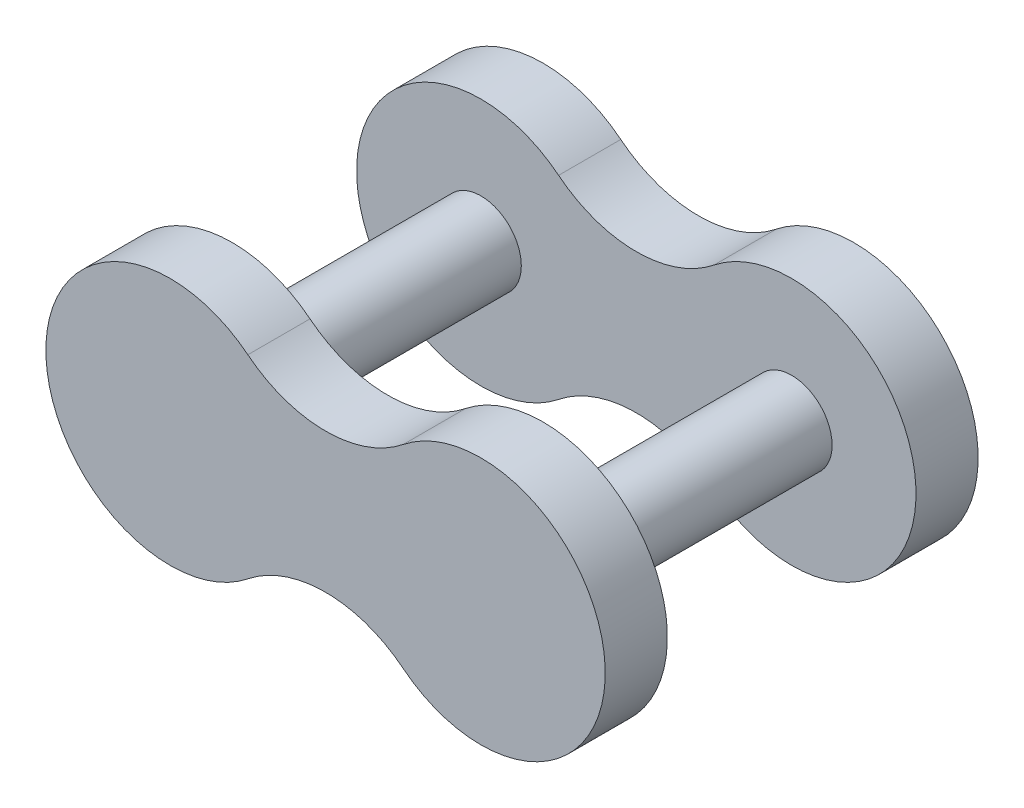
ISO-10303-21;
HEADER;
FILE_DESCRIPTION(('STEP AP214'),'2;1');
FILE_NAME('part.step','',(''),(''),'','','');
FILE_SCHEMA(('AUTOMOTIVE_DESIGN { 1 0 10303 214 1 1 1 1 }'));
ENDSEC;
DATA;
#1=APPLICATION_CONTEXT('core data for automotive mechanical design processes');
#2=APPLICATION_PROTOCOL_DEFINITION('international standard','automotive_design',2000,#1);
#3=PRODUCT_CONTEXT('',#1,'mechanical');
#4=PRODUCT('Part','Part','',(#3));
#5=PRODUCT_RELATED_PRODUCT_CATEGORY('part','',(#4));
#6=PRODUCT_DEFINITION_FORMATION('','',#4);
#7=PRODUCT_DEFINITION_CONTEXT('part definition',#1,'design');
#8=PRODUCT_DEFINITION('design','',#6,#7);
#9=PRODUCT_DEFINITION_SHAPE('','',#8);
#10=(LENGTH_UNIT() NAMED_UNIT(*) SI_UNIT(.MILLI.,.METRE.));
#11=(NAMED_UNIT(*) PLANE_ANGLE_UNIT() SI_UNIT($,.RADIAN.));
#12=(NAMED_UNIT(*) SI_UNIT($,.STERADIAN.) SOLID_ANGLE_UNIT());
#13=UNCERTAINTY_MEASURE_WITH_UNIT(LENGTH_MEASURE(1.E-05),#10,'distance_accuracy_value','');
#14=(GEOMETRIC_REPRESENTATION_CONTEXT(3) GLOBAL_UNCERTAINTY_ASSIGNED_CONTEXT((#13)) GLOBAL_UNIT_ASSIGNED_CONTEXT((#10,
#11,#12)) REPRESENTATION_CONTEXT('',''));
#15=CARTESIAN_POINT('',(0.,0.,0.));
#16=DIRECTION('',(0.,0.,1.));
#17=DIRECTION('',(1.,0.,0.));
#18=AXIS2_PLACEMENT_3D('',#15,#16,#17);
#19=CARTESIAN_POINT('',(3.175,0.,2.54));
#20=DIRECTION('',(0.,0.,-1.));
#21=DIRECTION('',(-1.,0.,0.));
#22=AXIS2_PLACEMENT_3D('',#19,#20,#21);
#23=CYLINDRICAL_SURFACE('',#22,0.8255);
#24=CARTESIAN_POINT('',(3.175,0.,2.54));
#25=DIRECTION('',(0.,0.,1.));
#26=DIRECTION('',(1.,0.,0.));
#27=AXIS2_PLACEMENT_3D('',#24,#25,#26);
#28=CIRCLE('',#27,0.8255);
#29=CARTESIAN_POINT('',(4.0005,0.,2.54));
#30=VERTEX_POINT('',#29);
#31=EDGE_CURVE('E48',#30,#30,#28,.T.);
#32=ORIENTED_EDGE('',*,*,#31,.F.);
#33=EDGE_LOOP('',(#32));
#34=FACE_BOUND('',#33,.T.);
#35=CARTESIAN_POINT('',(3.175,0.,-2.54));
#36=DIRECTION('',(0.,0.,1.));
#37=DIRECTION('',(1.,0.,0.));
#38=AXIS2_PLACEMENT_3D('',#35,#36,#37);
#39=CIRCLE('',#38,0.8255);
#40=CARTESIAN_POINT('',(4.0005,0.,-2.54));
#41=VERTEX_POINT('',#40);
#42=EDGE_CURVE('E173',#41,#41,#39,.T.);
#43=ORIENTED_EDGE('',*,*,#42,.T.);
#44=EDGE_LOOP('',(#43));
#45=FACE_BOUND('',#44,.T.);
#46=ADVANCED_FACE('F39',(#34,#45),#23,.T.);
#47=CARTESIAN_POINT('',(0.,3.96557372898298,3.81));
#48=DIRECTION('',(0.,0.,-1.));
#49=DIRECTION('',(-1.,0.,0.));
#50=AXIS2_PLACEMENT_3D('',#47,#48,#49);
#51=CYLINDRICAL_SURFACE('',#50,2.54);
#52=CARTESIAN_POINT('',(0.,3.96557372898298,2.54));
#53=DIRECTION('',(0.,0.,-1.));
#54=DIRECTION('',(1.,0.,0.));
#55=AXIS2_PLACEMENT_3D('',#52,#53,#54);
#56=CIRCLE('',#55,2.54);
#57=CARTESIAN_POINT('',(1.5875,1.98278686449149,2.54));
#58=VERTEX_POINT('',#57);
#59=CARTESIAN_POINT('',(-1.5875,1.98278686449149,2.54));
#60=VERTEX_POINT('',#59);
#61=EDGE_CURVE('E185',#58,#60,#56,.T.);
#62=ORIENTED_EDGE('',*,*,#61,.T.);
#63=DIRECTION('',(0.,0.,-1.));
#64=VECTOR('',#63,1.);
#65=CARTESIAN_POINT('',(-1.5875,1.98278686449149,3.81));
#66=LINE('',#65,#64);
#67=CARTESIAN_POINT('',(-1.5875,1.98278686449149,3.81));
#68=VERTEX_POINT('',#67);
#69=EDGE_CURVE('E204',#68,#60,#66,.T.);
#70=ORIENTED_EDGE('',*,*,#69,.F.);
#71=CARTESIAN_POINT('',(0.,3.96557372898298,3.81));
#72=DIRECTION('',(0.,0.,-1.));
#73=DIRECTION('',(1.,0.,0.));
#74=AXIS2_PLACEMENT_3D('',#71,#72,#73);
#75=CIRCLE('',#74,2.54);
#76=CARTESIAN_POINT('',(1.5875,1.98278686449149,3.81));
#77=VERTEX_POINT('',#76);
#78=EDGE_CURVE('E174',#77,#68,#75,.T.);
#79=ORIENTED_EDGE('',*,*,#78,.F.);
#80=DIRECTION('',(0.,0.,-1.));
#81=VECTOR('',#80,1.);
#82=CARTESIAN_POINT('',(1.5875,1.98278686449149,3.81));
#83=LINE('',#82,#81);
#84=EDGE_CURVE('E184',#77,#58,#83,.T.);
#85=ORIENTED_EDGE('',*,*,#84,.T.);
#86=EDGE_LOOP('',(#62,#70,#79,#85));
#87=FACE_BOUND('',#86,.T.);
#88=ADVANCED_FACE('F235',(#87),#51,.F.);
#89=CARTESIAN_POINT('',(-3.175,0.,3.81));
#90=DIRECTION('',(0.,0.,-1.));
#91=DIRECTION('',(-1.,0.,0.));
#92=AXIS2_PLACEMENT_3D('',#89,#90,#91);
#93=CYLINDRICAL_SURFACE('',#92,2.54);
#94=CARTESIAN_POINT('',(-3.175,0.,2.54));
#95=DIRECTION('',(0.,0.,1.));
#96=DIRECTION('',(1.,0.,0.));
#97=AXIS2_PLACEMENT_3D('',#94,#95,#96);
#98=CIRCLE('',#97,2.54);
#99=CARTESIAN_POINT('',(-1.5875,-1.98278686449149,2.54));
#100=VERTEX_POINT('',#99);
#101=EDGE_CURVE('E189',#60,#100,#98,.T.);
#102=ORIENTED_EDGE('',*,*,#101,.T.);
#103=DIRECTION('',(0.,0.,-1.));
#104=VECTOR('',#103,1.);
#105=CARTESIAN_POINT('',(-1.5875,-1.98278686449149,3.81));
#106=LINE('',#105,#104);
#107=CARTESIAN_POINT('',(-1.5875,-1.98278686449149,3.81));
#108=VERTEX_POINT('',#107);
#109=EDGE_CURVE('E201',#108,#100,#106,.T.);
#110=ORIENTED_EDGE('',*,*,#109,.F.);
#111=CARTESIAN_POINT('',(-3.175,0.,3.81));
#112=DIRECTION('',(0.,0.,1.));
#113=DIRECTION('',(1.,0.,0.));
#114=AXIS2_PLACEMENT_3D('',#111,#112,#113);
#115=CIRCLE('',#114,2.54);
#116=EDGE_CURVE('E88',#68,#108,#115,.T.);
#117=ORIENTED_EDGE('',*,*,#116,.F.);
#118=ORIENTED_EDGE('',*,*,#69,.T.);
#119=EDGE_LOOP('',(#102,#110,#117,#118));
#120=FACE_BOUND('',#119,.T.);
#121=ADVANCED_FACE('F240',(#120),#93,.T.);
#122=CARTESIAN_POINT('',(0.,-3.96557372898298,3.81));
#123=DIRECTION('',(0.,0.,-1.));
#124=DIRECTION('',(-1.,0.,0.));
#125=AXIS2_PLACEMENT_3D('',#122,#123,#124);
#126=CYLINDRICAL_SURFACE('',#125,2.54);
#127=CARTESIAN_POINT('',(0.,-3.96557372898298,2.54));
#128=DIRECTION('',(0.,0.,-1.));
#129=DIRECTION('',(1.,0.,0.));
#130=AXIS2_PLACEMENT_3D('',#127,#128,#129);
#131=CIRCLE('',#130,2.54);
#132=CARTESIAN_POINT('',(1.5875,-1.98278686449149,2.54));
#133=VERTEX_POINT('',#132);
#134=EDGE_CURVE('E74',#100,#133,#131,.T.);
#135=ORIENTED_EDGE('',*,*,#134,.T.);
#136=DIRECTION('',(0.,0.,-1.));
#137=VECTOR('',#136,1.);
#138=CARTESIAN_POINT('',(1.5875,-1.98278686449149,3.81));
#139=LINE('',#138,#137);
#140=CARTESIAN_POINT('',(1.5875,-1.98278686449149,3.81));
#141=VERTEX_POINT('',#140);
#142=EDGE_CURVE('E198',#141,#133,#139,.T.);
#143=ORIENTED_EDGE('',*,*,#142,.F.);
#144=CARTESIAN_POINT('',(0.,-3.96557372898298,3.81));
#145=DIRECTION('',(0.,0.,-1.));
#146=DIRECTION('',(1.,0.,0.));
#147=AXIS2_PLACEMENT_3D('',#144,#145,#146);
#148=CIRCLE('',#147,2.54);
#149=EDGE_CURVE('E179',#108,#141,#148,.T.);
#150=ORIENTED_EDGE('',*,*,#149,.F.);
#151=ORIENTED_EDGE('',*,*,#109,.T.);
#152=EDGE_LOOP('',(#135,#143,#150,#151));
#153=FACE_BOUND('',#152,.T.);
#154=ADVANCED_FACE('F256',(#153),#126,.F.);
#155=CARTESIAN_POINT('',(3.175,0.,3.81));
#156=DIRECTION('',(0.,0.,-1.));
#157=DIRECTION('',(-1.,0.,0.));
#158=AXIS2_PLACEMENT_3D('',#155,#156,#157);
#159=CYLINDRICAL_SURFACE('',#158,2.54);
#160=CARTESIAN_POINT('',(3.175,0.,2.54));
#161=DIRECTION('',(0.,0.,1.));
#162=DIRECTION('',(1.,0.,0.));
#163=AXIS2_PLACEMENT_3D('',#160,#161,#162);
#164=CIRCLE('',#163,2.54);
#165=EDGE_CURVE('E80',#133,#58,#164,.T.);
#166=ORIENTED_EDGE('',*,*,#165,.T.);
#167=ORIENTED_EDGE('',*,*,#84,.F.);
#168=CARTESIAN_POINT('',(3.175,0.,3.81));
#169=DIRECTION('',(0.,0.,1.));
#170=DIRECTION('',(1.,0.,0.));
#171=AXIS2_PLACEMENT_3D('',#168,#169,#170);
#172=CIRCLE('',#171,2.54);
#173=EDGE_CURVE('E56',#141,#77,#172,.T.);
#174=ORIENTED_EDGE('',*,*,#173,.F.);
#175=ORIENTED_EDGE('',*,*,#142,.T.);
#176=EDGE_LOOP('',(#166,#167,#174,#175));
#177=FACE_BOUND('',#176,.T.);
#178=ADVANCED_FACE('F254',(#177),#159,.T.);
#179=CARTESIAN_POINT('',(1.5875,1.98278686449149,3.81));
#180=DIRECTION('',(0.,0.,1.));
#181=DIRECTION('',(1.,0.,0.));
#182=AXIS2_PLACEMENT_3D('',#179,#180,#181);
#183=PLANE('',#182);
#184=ORIENTED_EDGE('',*,*,#78,.T.);
#185=ORIENTED_EDGE('',*,*,#116,.T.);
#186=ORIENTED_EDGE('',*,*,#149,.T.);
#187=ORIENTED_EDGE('',*,*,#173,.T.);
#188=EDGE_LOOP('',(#184,#185,#186,#187));
#189=FACE_BOUND('',#188,.T.);
#190=ADVANCED_FACE('F248',(#189),#183,.T.);
#191=CARTESIAN_POINT('',(1.5875,1.98278686449149,2.54));
#192=DIRECTION('',(0.,0.,1.));
#193=DIRECTION('',(1.,0.,0.));
#194=AXIS2_PLACEMENT_3D('',#191,#192,#193);
#195=PLANE('',#194);
#196=CARTESIAN_POINT('',(-3.175,0.,2.54));
#197=DIRECTION('',(0.,0.,1.));
#198=DIRECTION('',(1.,0.,0.));
#199=AXIS2_PLACEMENT_3D('',#196,#197,#198);
#200=CIRCLE('',#199,0.8255);
#201=CARTESIAN_POINT('',(-2.3495,0.,2.54));
#202=VERTEX_POINT('',#201);
#203=EDGE_CURVE('E11',#202,#202,#200,.F.);
#204=ORIENTED_EDGE('',*,*,#203,.F.);
#205=EDGE_LOOP('',(#204));
#206=FACE_BOUND('',#205,.T.);
#207=ORIENTED_EDGE('',*,*,#31,.T.);
#208=EDGE_LOOP('',(#207));
#209=FACE_BOUND('',#208,.T.);
#210=ORIENTED_EDGE('',*,*,#61,.F.);
#211=ORIENTED_EDGE('',*,*,#165,.F.);
#212=ORIENTED_EDGE('',*,*,#134,.F.);
#213=ORIENTED_EDGE('',*,*,#101,.F.);
#214=EDGE_LOOP('',(#210,#211,#212,#213));
#215=FACE_BOUND('',#214,.T.);
#216=ADVANCED_FACE('F244',(#206,#209,#215),#195,.F.);
#217=CARTESIAN_POINT('',(-3.175,0.,2.54));
#218=DIRECTION('',(0.,0.,-1.));
#219=DIRECTION('',(-1.,0.,0.));
#220=AXIS2_PLACEMENT_3D('',#217,#218,#219);
#221=CYLINDRICAL_SURFACE('',#220,0.8255);
#222=ORIENTED_EDGE('',*,*,#203,.T.);
#223=EDGE_LOOP('',(#222));
#224=FACE_BOUND('',#223,.T.);
#225=CARTESIAN_POINT('',(-3.175,0.,-2.54));
#226=DIRECTION('',(0.,0.,1.));
#227=DIRECTION('',(1.,0.,0.));
#228=AXIS2_PLACEMENT_3D('',#225,#226,#227);
#229=CIRCLE('',#228,0.8255);
#230=CARTESIAN_POINT('',(-2.3495,0.,-2.54));
#231=VERTEX_POINT('',#230);
#232=EDGE_CURVE('E127',#231,#231,#229,.T.);
#233=ORIENTED_EDGE('',*,*,#232,.T.);
#234=EDGE_LOOP('',(#233));
#235=FACE_BOUND('',#234,.T.);
#236=ADVANCED_FACE('F247',(#224,#235),#221,.T.);
#237=CARTESIAN_POINT('',(0.,3.96557372898298,-3.81));
#238=DIRECTION('',(0.,0.,1.));
#239=DIRECTION('',(1.,0.,0.));
#240=AXIS2_PLACEMENT_3D('',#237,#238,#239);
#241=CYLINDRICAL_SURFACE('',#240,2.54);
#242=CARTESIAN_POINT('',(0.,3.96557372898298,-2.54));
#243=DIRECTION('',(0.,0.,-1.));
#244=DIRECTION('',(1.,0.,0.));
#245=AXIS2_PLACEMENT_3D('',#242,#243,#244);
#246=CIRCLE('',#245,2.54);
#247=CARTESIAN_POINT('',(1.5875,1.98278686449149,-2.54));
#248=VERTEX_POINT('',#247);
#249=CARTESIAN_POINT('',(-1.5875,1.98278686449149,-2.54));
#250=VERTEX_POINT('',#249);
#251=EDGE_CURVE('E121',#248,#250,#246,.T.);
#252=ORIENTED_EDGE('',*,*,#251,.F.);
#253=DIRECTION('',(0.,0.,1.));
#254=VECTOR('',#253,1.);
#255=CARTESIAN_POINT('',(1.5875,1.98278686449149,-3.81));
#256=LINE('',#255,#254);
#257=CARTESIAN_POINT('',(1.5875,1.98278686449149,-3.81));
#258=VERTEX_POINT('',#257);
#259=EDGE_CURVE('E115',#258,#248,#256,.T.);
#260=ORIENTED_EDGE('',*,*,#259,.F.);
#261=CARTESIAN_POINT('',(0.,3.96557372898298,-3.81));
#262=DIRECTION('',(0.,0.,-1.));
#263=DIRECTION('',(1.,0.,0.));
#264=AXIS2_PLACEMENT_3D('',#261,#262,#263);
#265=CIRCLE('',#264,2.54);
#266=CARTESIAN_POINT('',(-1.5875,1.98278686449149,-3.81));
#267=VERTEX_POINT('',#266);
#268=EDGE_CURVE('E118',#258,#267,#265,.T.);
#269=ORIENTED_EDGE('',*,*,#268,.T.);
#270=DIRECTION('',(0.,0.,1.));
#271=VECTOR('',#270,1.);
#272=CARTESIAN_POINT('',(-1.5875,1.98278686449149,-3.81));
#273=LINE('',#272,#271);
#274=EDGE_CURVE('E150',#267,#250,#273,.T.);
#275=ORIENTED_EDGE('',*,*,#274,.T.);
#276=EDGE_LOOP('',(#252,#260,#269,#275));
#277=FACE_BOUND('',#276,.T.);
#278=ADVANCED_FACE('F117',(#277),#241,.F.);
#279=CARTESIAN_POINT('',(3.175,0.,-3.81));
#280=DIRECTION('',(0.,0.,1.));
#281=DIRECTION('',(1.,0.,0.));
#282=AXIS2_PLACEMENT_3D('',#279,#280,#281);
#283=CYLINDRICAL_SURFACE('',#282,2.54);
#284=CARTESIAN_POINT('',(3.175,0.,-2.54));
#285=DIRECTION('',(0.,0.,1.));
#286=DIRECTION('',(1.,0.,0.));
#287=AXIS2_PLACEMENT_3D('',#284,#285,#286);
#288=CIRCLE('',#287,2.54);
#289=CARTESIAN_POINT('',(1.5875,-1.98278686449149,-2.54));
#290=VERTEX_POINT('',#289);
#291=EDGE_CURVE('E153',#290,#248,#288,.T.);
#292=ORIENTED_EDGE('',*,*,#291,.F.);
#293=DIRECTION('',(0.,0.,1.));
#294=VECTOR('',#293,1.);
#295=CARTESIAN_POINT('',(1.5875,-1.98278686449149,-3.81));
#296=LINE('',#295,#294);
#297=CARTESIAN_POINT('',(1.5875,-1.98278686449149,-3.81));
#298=VERTEX_POINT('',#297);
#299=EDGE_CURVE('E128',#298,#290,#296,.T.);
#300=ORIENTED_EDGE('',*,*,#299,.F.);
#301=CARTESIAN_POINT('',(3.175,0.,-3.81));
#302=DIRECTION('',(0.,0.,1.));
#303=DIRECTION('',(1.,0.,0.));
#304=AXIS2_PLACEMENT_3D('',#301,#302,#303);
#305=CIRCLE('',#304,2.54);
#306=EDGE_CURVE('E134',#298,#258,#305,.T.);
#307=ORIENTED_EDGE('',*,*,#306,.T.);
#308=ORIENTED_EDGE('',*,*,#259,.T.);
#309=EDGE_LOOP('',(#292,#300,#307,#308));
#310=FACE_BOUND('',#309,.T.);
#311=ADVANCED_FACE('F141',(#310),#283,.T.);
#312=CARTESIAN_POINT('',(0.,-3.96557372898298,-3.81));
#313=DIRECTION('',(0.,0.,1.));
#314=DIRECTION('',(1.,0.,0.));
#315=AXIS2_PLACEMENT_3D('',#312,#313,#314);
#316=CYLINDRICAL_SURFACE('',#315,2.54);
#317=CARTESIAN_POINT('',(0.,-3.96557372898298,-2.54));
#318=DIRECTION('',(0.,0.,-1.));
#319=DIRECTION('',(1.,0.,0.));
#320=AXIS2_PLACEMENT_3D('',#317,#318,#319);
#321=CIRCLE('',#320,2.54);
#322=CARTESIAN_POINT('',(-1.5875,-1.98278686449149,-2.54));
#323=VERTEX_POINT('',#322);
#324=EDGE_CURVE('E156',#323,#290,#321,.T.);
#325=ORIENTED_EDGE('',*,*,#324,.F.);
#326=DIRECTION('',(0.,0.,1.));
#327=VECTOR('',#326,1.);
#328=CARTESIAN_POINT('',(-1.5875,-1.98278686449149,-3.81));
#329=LINE('',#328,#327);
#330=CARTESIAN_POINT('',(-1.5875,-1.98278686449149,-3.81));
#331=VERTEX_POINT('',#330);
#332=EDGE_CURVE('E165',#331,#323,#329,.T.);
#333=ORIENTED_EDGE('',*,*,#332,.F.);
#334=CARTESIAN_POINT('',(0.,-3.96557372898298,-3.81));
#335=DIRECTION('',(0.,0.,-1.));
#336=DIRECTION('',(1.,0.,0.));
#337=AXIS2_PLACEMENT_3D('',#334,#335,#336);
#338=CIRCLE('',#337,2.54);
#339=EDGE_CURVE('E143',#331,#298,#338,.T.);
#340=ORIENTED_EDGE('',*,*,#339,.T.);
#341=ORIENTED_EDGE('',*,*,#299,.T.);
#342=EDGE_LOOP('',(#325,#333,#340,#341));
#343=FACE_BOUND('',#342,.T.);
#344=ADVANCED_FACE('F225',(#343),#316,.F.);
#345=CARTESIAN_POINT('',(-3.175,0.,-3.81));
#346=DIRECTION('',(0.,0.,1.));
#347=DIRECTION('',(1.,0.,0.));
#348=AXIS2_PLACEMENT_3D('',#345,#346,#347);
#349=CYLINDRICAL_SURFACE('',#348,2.54);
#350=CARTESIAN_POINT('',(-3.175,0.,-2.54));
#351=DIRECTION('',(0.,0.,1.));
#352=DIRECTION('',(1.,0.,0.));
#353=AXIS2_PLACEMENT_3D('',#350,#351,#352);
#354=CIRCLE('',#353,2.54);
#355=EDGE_CURVE('E139',#250,#323,#354,.T.);
#356=ORIENTED_EDGE('',*,*,#355,.F.);
#357=ORIENTED_EDGE('',*,*,#274,.F.);
#358=CARTESIAN_POINT('',(-3.175,0.,-3.81));
#359=DIRECTION('',(0.,0.,1.));
#360=DIRECTION('',(1.,0.,0.));
#361=AXIS2_PLACEMENT_3D('',#358,#359,#360);
#362=CIRCLE('',#361,2.54);
#363=EDGE_CURVE('E137',#267,#331,#362,.T.);
#364=ORIENTED_EDGE('',*,*,#363,.T.);
#365=ORIENTED_EDGE('',*,*,#332,.T.);
#366=EDGE_LOOP('',(#356,#357,#364,#365));
#367=FACE_BOUND('',#366,.T.);
#368=ADVANCED_FACE('F222',(#367),#349,.T.);
#369=CARTESIAN_POINT('',(1.5875,1.98278686449149,-3.81));
#370=DIRECTION('',(0.,0.,-1.));
#371=DIRECTION('',(1.,0.,0.));
#372=AXIS2_PLACEMENT_3D('',#369,#370,#371);
#373=PLANE('',#372);
#374=ORIENTED_EDGE('',*,*,#268,.F.);
#375=ORIENTED_EDGE('',*,*,#306,.F.);
#376=ORIENTED_EDGE('',*,*,#339,.F.);
#377=ORIENTED_EDGE('',*,*,#363,.F.);
#378=EDGE_LOOP('',(#374,#375,#376,#377));
#379=FACE_BOUND('',#378,.T.);
#380=ADVANCED_FACE('F132',(#379),#373,.T.);
#381=CARTESIAN_POINT('',(1.5875,1.98278686449149,-2.54));
#382=DIRECTION('',(0.,0.,-1.));
#383=DIRECTION('',(1.,0.,0.));
#384=AXIS2_PLACEMENT_3D('',#381,#382,#383);
#385=PLANE('',#384);
#386=ORIENTED_EDGE('',*,*,#42,.F.);
#387=EDGE_LOOP('',(#386));
#388=FACE_BOUND('',#387,.T.);
#389=ORIENTED_EDGE('',*,*,#232,.F.);
#390=EDGE_LOOP('',(#389));
#391=FACE_BOUND('',#390,.T.);
#392=ORIENTED_EDGE('',*,*,#251,.T.);
#393=ORIENTED_EDGE('',*,*,#355,.T.);
#394=ORIENTED_EDGE('',*,*,#324,.T.);
#395=ORIENTED_EDGE('',*,*,#291,.T.);
#396=EDGE_LOOP('',(#392,#393,#394,#395));
#397=FACE_BOUND('',#396,.T.);
#398=ADVANCED_FACE('F214',(#388,#391,#397),#385,.F.);
#399=CLOSED_SHELL('',(#46,#88,#121,#154,#178,#190,#216,#236,#278,#311,#344,#368,#380,#398));
#400=MANIFOLD_SOLID_BREP('B2',#399);
#401=ADVANCED_BREP_SHAPE_REPRESENTATION('',(#18,#400),#14);
#402=SHAPE_DEFINITION_REPRESENTATION(#9,#401);
ENDSEC;
END-ISO-10303-21;
